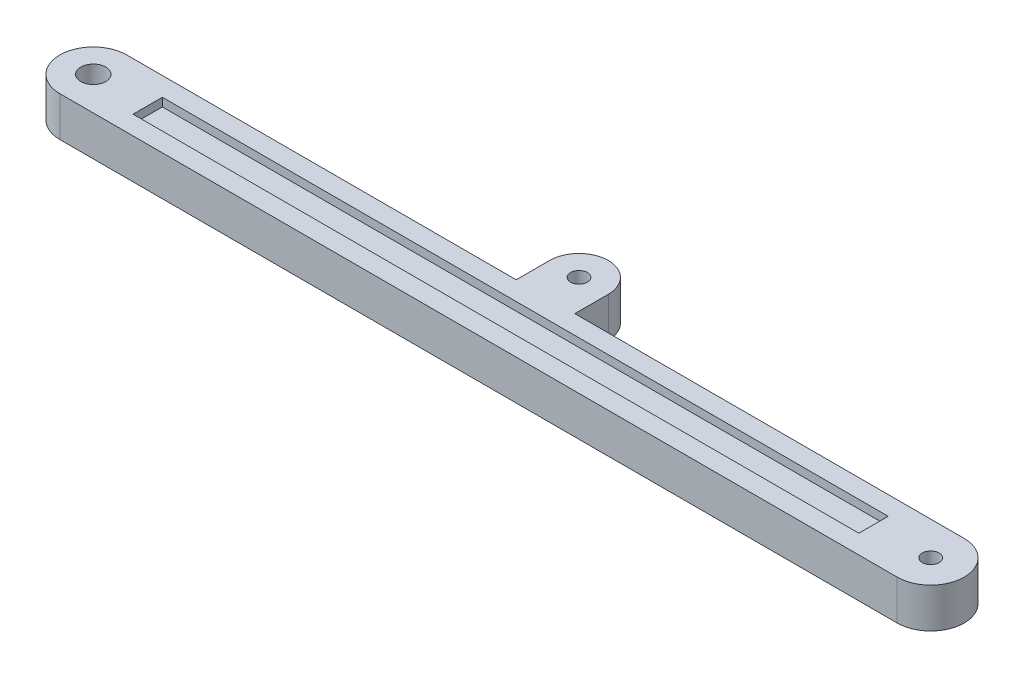
ISO-10303-21;
HEADER;
FILE_DESCRIPTION(('STEP AP214'),'2;1');
FILE_NAME('part.step','',(''),(''),'','','');
FILE_SCHEMA(('AUTOMOTIVE_DESIGN { 1 0 10303 214 1 1 1 1 }'));
ENDSEC;
DATA;
#1=APPLICATION_CONTEXT('core data for automotive mechanical design processes');
#2=APPLICATION_PROTOCOL_DEFINITION('international standard','automotive_design',2000,#1);
#3=PRODUCT_CONTEXT('',#1,'mechanical');
#4=PRODUCT('Part','Part','',(#3));
#5=PRODUCT_RELATED_PRODUCT_CATEGORY('part','',(#4));
#6=PRODUCT_DEFINITION_FORMATION('','',#4);
#7=PRODUCT_DEFINITION_CONTEXT('part definition',#1,'design');
#8=PRODUCT_DEFINITION('design','',#6,#7);
#9=PRODUCT_DEFINITION_SHAPE('','',#8);
#10=(LENGTH_UNIT() NAMED_UNIT(*) SI_UNIT(.MILLI.,.METRE.));
#11=(NAMED_UNIT(*) PLANE_ANGLE_UNIT() SI_UNIT($,.RADIAN.));
#12=(NAMED_UNIT(*) SI_UNIT($,.STERADIAN.) SOLID_ANGLE_UNIT());
#13=UNCERTAINTY_MEASURE_WITH_UNIT(LENGTH_MEASURE(1.E-05),#10,'distance_accuracy_value','');
#14=(GEOMETRIC_REPRESENTATION_CONTEXT(3) GLOBAL_UNCERTAINTY_ASSIGNED_CONTEXT((#13)) GLOBAL_UNIT_ASSIGNED_CONTEXT((#10,
#11,#12)) REPRESENTATION_CONTEXT('',''));
#15=CARTESIAN_POINT('',(0.,0.,0.));
#16=DIRECTION('',(0.,0.,1.));
#17=DIRECTION('',(1.,0.,0.));
#18=AXIS2_PLACEMENT_3D('',#15,#16,#17);
#19=CARTESIAN_POINT('',(-10.,9.5,-8.));
#20=DIRECTION('',(0.,-1.,0.));
#21=DIRECTION('',(0.,0.,-1.));
#22=AXIS2_PLACEMENT_3D('',#19,#20,#21);
#23=CYLINDRICAL_SURFACE('',#22,8.);
#24=CARTESIAN_POINT('',(-10.,0.,-8.));
#25=DIRECTION('',(0.,1.,0.));
#26=DIRECTION('',(0.,0.,1.));
#27=AXIS2_PLACEMENT_3D('',#24,#25,#26);
#28=CIRCLE('',#27,8.);
#29=CARTESIAN_POINT('',(-10.,0.,-16.));
#30=VERTEX_POINT('',#29);
#31=CARTESIAN_POINT('',(-10.,0.,0.));
#32=VERTEX_POINT('',#31);
#33=EDGE_CURVE('E155',#30,#32,#28,.T.);
#34=ORIENTED_EDGE('',*,*,#33,.T.);
#35=DIRECTION('',(0.,-1.,0.));
#36=VECTOR('',#35,1.);
#37=CARTESIAN_POINT('',(-10.,9.5,0.));
#38=LINE('',#37,#36);
#39=CARTESIAN_POINT('',(-10.,9.5,0.));
#40=VERTEX_POINT('',#39);
#41=EDGE_CURVE('E11',#40,#32,#38,.T.);
#42=ORIENTED_EDGE('',*,*,#41,.F.);
#43=CARTESIAN_POINT('',(-10.,9.5,-8.));
#44=DIRECTION('',(0.,1.,0.));
#45=DIRECTION('',(0.,0.,1.));
#46=AXIS2_PLACEMENT_3D('',#43,#44,#45);
#47=CIRCLE('',#46,8.);
#48=CARTESIAN_POINT('',(-10.,9.5,-16.));
#49=VERTEX_POINT('',#48);
#50=EDGE_CURVE('E208',#49,#40,#47,.T.);
#51=ORIENTED_EDGE('',*,*,#50,.F.);
#52=DIRECTION('',(0.,-1.,0.));
#53=VECTOR('',#52,1.);
#54=CARTESIAN_POINT('',(-10.,9.5,-16.));
#55=LINE('',#54,#53);
#56=EDGE_CURVE('E58',#49,#30,#55,.T.);
#57=ORIENTED_EDGE('',*,*,#56,.T.);
#58=EDGE_LOOP('',(#34,#42,#51,#57));
#59=FACE_BOUND('',#58,.T.);
#60=ADVANCED_FACE('F34',(#59),#23,.T.);
#61=CARTESIAN_POINT('',(0.,9.5,0.));
#62=DIRECTION('',(0.,0.,-1.));
#63=DIRECTION('',(-1.,0.,0.));
#64=AXIS2_PLACEMENT_3D('',#61,#62,#63);
#65=PLANE('',#64);
#66=DIRECTION('',(1.,0.,0.));
#67=VECTOR('',#66,1.);
#68=CARTESIAN_POINT('',(0.,0.,0.));
#69=LINE('',#68,#67);
#70=CARTESIAN_POINT('',(190.,0.,0.));
#71=VERTEX_POINT('',#70);
#72=EDGE_CURVE('E158',#32,#71,#69,.T.);
#73=ORIENTED_EDGE('',*,*,#72,.T.);
#74=DIRECTION('',(0.,-1.,0.));
#75=VECTOR('',#74,1.);
#76=CARTESIAN_POINT('',(190.,9.5,0.));
#77=LINE('',#76,#75);
#78=CARTESIAN_POINT('',(190.,9.5,0.));
#79=VERTEX_POINT('',#78);
#80=EDGE_CURVE('E42',#79,#71,#77,.T.);
#81=ORIENTED_EDGE('',*,*,#80,.F.);
#82=DIRECTION('',(1.,0.,0.));
#83=VECTOR('',#82,1.);
#84=CARTESIAN_POINT('',(0.,9.5,0.));
#85=LINE('',#84,#83);
#86=EDGE_CURVE('E97',#40,#79,#85,.T.);
#87=ORIENTED_EDGE('',*,*,#86,.F.);
#88=ORIENTED_EDGE('',*,*,#41,.T.);
#89=EDGE_LOOP('',(#73,#81,#87,#88));
#90=FACE_BOUND('',#89,.T.);
#91=ADVANCED_FACE('F283',(#90),#65,.F.);
#92=CARTESIAN_POINT('',(190.,9.5,-8.00000000000002));
#93=DIRECTION('',(0.,-1.,0.));
#94=DIRECTION('',(0.,0.,-1.));
#95=AXIS2_PLACEMENT_3D('',#92,#93,#94);
#96=CYLINDRICAL_SURFACE('',#95,8.00000000000001);
#97=CARTESIAN_POINT('',(190.,0.,-8.00000000000002));
#98=DIRECTION('',(0.,1.,0.));
#99=DIRECTION('',(0.,0.,1.));
#100=AXIS2_PLACEMENT_3D('',#97,#98,#99);
#101=CIRCLE('',#100,8.00000000000001);
#102=CARTESIAN_POINT('',(190.,0.,-16.));
#103=VERTEX_POINT('',#102);
#104=EDGE_CURVE('E160',#71,#103,#101,.T.);
#105=ORIENTED_EDGE('',*,*,#104,.T.);
#106=DIRECTION('',(0.,-1.,0.));
#107=VECTOR('',#106,1.);
#108=CARTESIAN_POINT('',(190.,9.5,-16.));
#109=LINE('',#108,#107);
#110=CARTESIAN_POINT('',(190.,9.5,-16.));
#111=VERTEX_POINT('',#110);
#112=EDGE_CURVE('E187',#111,#103,#109,.T.);
#113=ORIENTED_EDGE('',*,*,#112,.F.);
#114=CARTESIAN_POINT('',(190.,9.5,-8.00000000000002));
#115=DIRECTION('',(0.,1.,0.));
#116=DIRECTION('',(0.,0.,1.));
#117=AXIS2_PLACEMENT_3D('',#114,#115,#116);
#118=CIRCLE('',#117,8.00000000000001);
#119=EDGE_CURVE('E194',#79,#111,#118,.T.);
#120=ORIENTED_EDGE('',*,*,#119,.F.);
#121=ORIENTED_EDGE('',*,*,#80,.T.);
#122=EDGE_LOOP('',(#105,#113,#120,#121));
#123=FACE_BOUND('',#122,.T.);
#124=ADVANCED_FACE('F192',(#123),#96,.T.);
#125=CARTESIAN_POINT('',(0.,9.5,-16.));
#126=DIRECTION('',(0.,0.,-1.));
#127=DIRECTION('',(-1.,0.,0.));
#128=AXIS2_PLACEMENT_3D('',#125,#126,#127);
#129=PLANE('',#128);
#130=DIRECTION('',(1.,0.,0.));
#131=VECTOR('',#130,1.);
#132=CARTESIAN_POINT('',(0.,0.,-16.));
#133=LINE('',#132,#131);
#134=CARTESIAN_POINT('',(97.,0.,-16.));
#135=VERTEX_POINT('',#134);
#136=EDGE_CURVE('E163',#135,#103,#133,.T.);
#137=ORIENTED_EDGE('',*,*,#136,.F.);
#138=DIRECTION('',(0.,-1.,0.));
#139=VECTOR('',#138,1.);
#140=CARTESIAN_POINT('',(97.,9.5,-16.));
#141=LINE('',#140,#139);
#142=CARTESIAN_POINT('',(97.,9.5,-16.));
#143=VERTEX_POINT('',#142);
#144=EDGE_CURVE('E185',#143,#135,#141,.T.);
#145=ORIENTED_EDGE('',*,*,#144,.F.);
#146=DIRECTION('',(1.,0.,0.));
#147=VECTOR('',#146,1.);
#148=CARTESIAN_POINT('',(0.,9.5,-16.));
#149=LINE('',#148,#147);
#150=EDGE_CURVE('E203',#143,#111,#149,.T.);
#151=ORIENTED_EDGE('',*,*,#150,.T.);
#152=ORIENTED_EDGE('',*,*,#112,.T.);
#153=EDGE_LOOP('',(#137,#145,#151,#152));
#154=FACE_BOUND('',#153,.T.);
#155=ADVANCED_FACE('F201',(#154),#129,.T.);
#156=CARTESIAN_POINT('',(97.,9.5,0.));
#157=DIRECTION('',(1.,0.,0.));
#158=DIRECTION('',(0.,0.,-1.));
#159=AXIS2_PLACEMENT_3D('',#156,#157,#158);
#160=PLANE('',#159);
#161=DIRECTION('',(0.,0.,1.));
#162=VECTOR('',#161,1.);
#163=CARTESIAN_POINT('',(97.,0.,0.));
#164=LINE('',#163,#162);
#165=CARTESIAN_POINT('',(97.,0.,-24.));
#166=VERTEX_POINT('',#165);
#167=EDGE_CURVE('E166',#166,#135,#164,.T.);
#168=ORIENTED_EDGE('',*,*,#167,.F.);
#169=DIRECTION('',(0.,-1.,0.));
#170=VECTOR('',#169,1.);
#171=CARTESIAN_POINT('',(97.,9.5,-24.));
#172=LINE('',#171,#170);
#173=CARTESIAN_POINT('',(97.,9.5,-24.));
#174=VERTEX_POINT('',#173);
#175=EDGE_CURVE('E137',#174,#166,#172,.T.);
#176=ORIENTED_EDGE('',*,*,#175,.F.);
#177=DIRECTION('',(0.,0.,1.));
#178=VECTOR('',#177,1.);
#179=CARTESIAN_POINT('',(97.,9.5,0.));
#180=LINE('',#179,#178);
#181=EDGE_CURVE('E126',#174,#143,#180,.T.);
#182=ORIENTED_EDGE('',*,*,#181,.T.);
#183=ORIENTED_EDGE('',*,*,#144,.T.);
#184=EDGE_LOOP('',(#168,#176,#182,#183));
#185=FACE_BOUND('',#184,.T.);
#186=ADVANCED_FACE('F293',(#185),#160,.T.);
#187=CARTESIAN_POINT('',(90.,9.5,-24.));
#188=DIRECTION('',(0.,-1.,0.));
#189=DIRECTION('',(0.,0.,-1.));
#190=AXIS2_PLACEMENT_3D('',#187,#188,#189);
#191=CYLINDRICAL_SURFACE('',#190,7.00000000000002);
#192=CARTESIAN_POINT('',(90.,0.,-24.));
#193=DIRECTION('',(0.,1.,0.));
#194=DIRECTION('',(0.,0.,1.));
#195=AXIS2_PLACEMENT_3D('',#192,#193,#194);
#196=CIRCLE('',#195,7.00000000000002);
#197=CARTESIAN_POINT('',(83.,0.,-24.));
#198=VERTEX_POINT('',#197);
#199=EDGE_CURVE('E133',#166,#198,#196,.T.);
#200=ORIENTED_EDGE('',*,*,#199,.T.);
#201=DIRECTION('',(0.,-1.,0.));
#202=VECTOR('',#201,1.);
#203=CARTESIAN_POINT('',(83.,9.5,-24.));
#204=LINE('',#203,#202);
#205=CARTESIAN_POINT('',(83.,9.5,-24.));
#206=VERTEX_POINT('',#205);
#207=EDGE_CURVE('E130',#206,#198,#204,.T.);
#208=ORIENTED_EDGE('',*,*,#207,.F.);
#209=CARTESIAN_POINT('',(90.,9.5,-24.));
#210=DIRECTION('',(0.,1.,0.));
#211=DIRECTION('',(0.,0.,1.));
#212=AXIS2_PLACEMENT_3D('',#209,#210,#211);
#213=CIRCLE('',#212,7.00000000000002);
#214=EDGE_CURVE('E116',#174,#206,#213,.T.);
#215=ORIENTED_EDGE('',*,*,#214,.F.);
#216=ORIENTED_EDGE('',*,*,#175,.T.);
#217=EDGE_LOOP('',(#200,#208,#215,#216));
#218=FACE_BOUND('',#217,.T.);
#219=ADVANCED_FACE('F131',(#218),#191,.T.);
#220=CARTESIAN_POINT('',(83.,9.5,0.));
#221=DIRECTION('',(1.,0.,0.));
#222=DIRECTION('',(0.,0.,-1.));
#223=AXIS2_PLACEMENT_3D('',#220,#221,#222);
#224=PLANE('',#223);
#225=DIRECTION('',(0.,0.,1.));
#226=VECTOR('',#225,1.);
#227=CARTESIAN_POINT('',(83.,0.,0.));
#228=LINE('',#227,#226);
#229=CARTESIAN_POINT('',(83.,0.,-16.));
#230=VERTEX_POINT('',#229);
#231=EDGE_CURVE('E170',#198,#230,#228,.T.);
#232=ORIENTED_EDGE('',*,*,#231,.T.);
#233=DIRECTION('',(0.,-1.,0.));
#234=VECTOR('',#233,1.);
#235=CARTESIAN_POINT('',(83.,9.5,-16.));
#236=LINE('',#235,#234);
#237=CARTESIAN_POINT('',(83.,9.5,-16.));
#238=VERTEX_POINT('',#237);
#239=EDGE_CURVE('E138',#238,#230,#236,.T.);
#240=ORIENTED_EDGE('',*,*,#239,.F.);
#241=DIRECTION('',(0.,0.,1.));
#242=VECTOR('',#241,1.);
#243=CARTESIAN_POINT('',(83.,9.5,0.));
#244=LINE('',#243,#242);
#245=EDGE_CURVE('E122',#206,#238,#244,.T.);
#246=ORIENTED_EDGE('',*,*,#245,.F.);
#247=ORIENTED_EDGE('',*,*,#207,.T.);
#248=EDGE_LOOP('',(#232,#240,#246,#247));
#249=FACE_BOUND('',#248,.T.);
#250=ADVANCED_FACE('F140',(#249),#224,.F.);
#251=CARTESIAN_POINT('',(90.,9.5,-24.));
#252=DIRECTION('',(0.,-1.,0.));
#253=DIRECTION('',(0.,0.,-1.));
#254=AXIS2_PLACEMENT_3D('',#251,#252,#253);
#255=CYLINDRICAL_SURFACE('',#254,2.);
#256=CARTESIAN_POINT('',(90.,9.5,-24.));
#257=DIRECTION('',(0.,1.,0.));
#258=DIRECTION('',(0.,0.,1.));
#259=AXIS2_PLACEMENT_3D('',#256,#257,#258);
#260=CIRCLE('',#259,2.);
#261=CARTESIAN_POINT('',(90.,9.5,-22.));
#262=VERTEX_POINT('',#261);
#263=EDGE_CURVE('E143',#262,#262,#260,.T.);
#264=ORIENTED_EDGE('',*,*,#263,.T.);
#265=EDGE_LOOP('',(#264));
#266=FACE_BOUND('',#265,.T.);
#267=CARTESIAN_POINT('',(90.,0.,-24.));
#268=DIRECTION('',(0.,1.,0.));
#269=DIRECTION('',(0.,0.,1.));
#270=AXIS2_PLACEMENT_3D('',#267,#268,#269);
#271=CIRCLE('',#270,2.);
#272=CARTESIAN_POINT('',(90.,0.,-22.));
#273=VERTEX_POINT('',#272);
#274=EDGE_CURVE('E175',#273,#273,#271,.T.);
#275=ORIENTED_EDGE('',*,*,#274,.F.);
#276=EDGE_LOOP('',(#275));
#277=FACE_BOUND('',#276,.T.);
#278=ADVANCED_FACE('F301',(#266,#277),#255,.F.);
#279=CARTESIAN_POINT('',(0.,9.5,-16.));
#280=DIRECTION('',(0.,0.,-1.));
#281=DIRECTION('',(-1.,0.,0.));
#282=AXIS2_PLACEMENT_3D('',#279,#280,#281);
#283=PLANE('',#282);
#284=DIRECTION('',(1.,0.,0.));
#285=VECTOR('',#284,1.);
#286=CARTESIAN_POINT('',(0.,0.,-16.));
#287=LINE('',#286,#285);
#288=EDGE_CURVE('E172',#30,#230,#287,.T.);
#289=ORIENTED_EDGE('',*,*,#288,.F.);
#290=ORIENTED_EDGE('',*,*,#56,.F.);
#291=DIRECTION('',(1.,0.,0.));
#292=VECTOR('',#291,1.);
#293=CARTESIAN_POINT('',(0.,9.5,-16.));
#294=LINE('',#293,#292);
#295=EDGE_CURVE('E141',#49,#238,#294,.T.);
#296=ORIENTED_EDGE('',*,*,#295,.T.);
#297=ORIENTED_EDGE('',*,*,#239,.T.);
#298=EDGE_LOOP('',(#289,#290,#296,#297));
#299=FACE_BOUND('',#298,.T.);
#300=ADVANCED_FACE('F302',(#299),#283,.T.);
#301=CARTESIAN_POINT('',(-10.,9.5,-8.));
#302=DIRECTION('',(0.,-1.,0.));
#303=DIRECTION('',(0.,0.,-1.));
#304=AXIS2_PLACEMENT_3D('',#301,#302,#303);
#305=CYLINDRICAL_SURFACE('',#304,3.);
#306=CARTESIAN_POINT('',(-10.,9.5,-8.));
#307=DIRECTION('',(0.,1.,0.));
#308=DIRECTION('',(0.,0.,1.));
#309=AXIS2_PLACEMENT_3D('',#306,#307,#308);
#310=CIRCLE('',#309,3.);
#311=CARTESIAN_POINT('',(-10.,9.5,-5.));
#312=VERTEX_POINT('',#311);
#313=EDGE_CURVE('E181',#312,#312,#310,.T.);
#314=ORIENTED_EDGE('',*,*,#313,.T.);
#315=EDGE_LOOP('',(#314));
#316=FACE_BOUND('',#315,.T.);
#317=CARTESIAN_POINT('',(-10.,0.,-8.));
#318=DIRECTION('',(0.,1.,0.));
#319=DIRECTION('',(0.,0.,1.));
#320=AXIS2_PLACEMENT_3D('',#317,#318,#319);
#321=CIRCLE('',#320,3.);
#322=CARTESIAN_POINT('',(-10.,0.,-5.));
#323=VERTEX_POINT('',#322);
#324=EDGE_CURVE('E152',#323,#323,#321,.T.);
#325=ORIENTED_EDGE('',*,*,#324,.F.);
#326=EDGE_LOOP('',(#325));
#327=FACE_BOUND('',#326,.T.);
#328=ADVANCED_FACE('F36',(#316,#327),#305,.F.);
#329=CARTESIAN_POINT('',(190.,9.5,-8.00000000000002));
#330=DIRECTION('',(0.,-1.,0.));
#331=DIRECTION('',(0.,0.,-1.));
#332=AXIS2_PLACEMENT_3D('',#329,#330,#331);
#333=CYLINDRICAL_SURFACE('',#332,2.);
#334=CARTESIAN_POINT('',(190.,9.5,-8.00000000000002));
#335=DIRECTION('',(0.,1.,0.));
#336=DIRECTION('',(0.,0.,1.));
#337=AXIS2_PLACEMENT_3D('',#334,#335,#336);
#338=CIRCLE('',#337,2.);
#339=CARTESIAN_POINT('',(190.,9.5,-6.00000000000002));
#340=VERTEX_POINT('',#339);
#341=EDGE_CURVE('E149',#340,#340,#338,.T.);
#342=ORIENTED_EDGE('',*,*,#341,.T.);
#343=EDGE_LOOP('',(#342));
#344=FACE_BOUND('',#343,.T.);
#345=CARTESIAN_POINT('',(190.,0.,-8.00000000000002));
#346=DIRECTION('',(0.,1.,0.));
#347=DIRECTION('',(0.,0.,1.));
#348=AXIS2_PLACEMENT_3D('',#345,#346,#347);
#349=CIRCLE('',#348,2.);
#350=CARTESIAN_POINT('',(190.,0.,-6.00000000000002));
#351=VERTEX_POINT('',#350);
#352=EDGE_CURVE('E178',#351,#351,#349,.T.);
#353=ORIENTED_EDGE('',*,*,#352,.F.);
#354=EDGE_LOOP('',(#353));
#355=FACE_BOUND('',#354,.T.);
#356=ADVANCED_FACE('F308',(#344,#355),#333,.F.);
#357=CARTESIAN_POINT('',(0.,9.5,0.));
#358=DIRECTION('',(0.,1.,0.));
#359=DIRECTION('',(0.,0.,1.));
#360=AXIS2_PLACEMENT_3D('',#357,#358,#359);
#361=PLANE('',#360);
#362=DIRECTION('',(0.,0.,1.));
#363=VECTOR('',#362,1.);
#364=CARTESIAN_POINT('',(3.,9.5,-11.5));
#365=LINE('',#364,#363);
#366=CARTESIAN_POINT('',(3.,9.5,-11.5));
#367=VERTEX_POINT('',#366);
#368=CARTESIAN_POINT('',(3.,9.5,-4.5));
#369=VERTEX_POINT('',#368);
#370=EDGE_CURVE('E49',#367,#369,#365,.T.);
#371=ORIENTED_EDGE('',*,*,#370,.F.);
#372=DIRECTION('',(-1.,0.,0.));
#373=VECTOR('',#372,1.);
#374=CARTESIAN_POINT('',(3.,9.5,-11.5));
#375=LINE('',#374,#373);
#376=CARTESIAN_POINT('',(176.341634435007,9.5,-11.5));
#377=VERTEX_POINT('',#376);
#378=EDGE_CURVE('E222',#377,#367,#375,.T.);
#379=ORIENTED_EDGE('',*,*,#378,.F.);
#380=DIRECTION('',(0.,0.,-1.));
#381=VECTOR('',#380,1.);
#382=CARTESIAN_POINT('',(176.341634435007,9.5,-11.5));
#383=LINE('',#382,#381);
#384=CARTESIAN_POINT('',(176.341634435007,9.5,-4.5));
#385=VERTEX_POINT('',#384);
#386=EDGE_CURVE('E226',#385,#377,#383,.T.);
#387=ORIENTED_EDGE('',*,*,#386,.F.);
#388=DIRECTION('',(1.,0.,0.));
#389=VECTOR('',#388,1.);
#390=CARTESIAN_POINT('',(3.,9.5,-4.5));
#391=LINE('',#390,#389);
#392=EDGE_CURVE('E229',#369,#385,#391,.T.);
#393=ORIENTED_EDGE('',*,*,#392,.F.);
#394=EDGE_LOOP('',(#371,#379,#387,#393));
#395=FACE_BOUND('',#394,.T.);
#396=ORIENTED_EDGE('',*,*,#313,.F.);
#397=EDGE_LOOP('',(#396));
#398=FACE_BOUND('',#397,.T.);
#399=ORIENTED_EDGE('',*,*,#50,.T.);
#400=ORIENTED_EDGE('',*,*,#86,.T.);
#401=ORIENTED_EDGE('',*,*,#119,.T.);
#402=ORIENTED_EDGE('',*,*,#150,.F.);
#403=ORIENTED_EDGE('',*,*,#181,.F.);
#404=ORIENTED_EDGE('',*,*,#214,.T.);
#405=ORIENTED_EDGE('',*,*,#245,.T.);
#406=ORIENTED_EDGE('',*,*,#295,.F.);
#407=EDGE_LOOP('',(#399,#400,#401,#402,#403,#404,#405,#406));
#408=FACE_BOUND('',#407,.T.);
#409=ORIENTED_EDGE('',*,*,#263,.F.);
#410=EDGE_LOOP('',(#409));
#411=FACE_BOUND('',#410,.T.);
#412=ORIENTED_EDGE('',*,*,#341,.F.);
#413=EDGE_LOOP('',(#412));
#414=FACE_BOUND('',#413,.T.);
#415=ADVANCED_FACE('F118',(#395,#398,#408,#411,#414),#361,.T.);
#416=CARTESIAN_POINT('',(0.,0.,0.));
#417=DIRECTION('',(0.,1.,0.));
#418=DIRECTION('',(0.,0.,1.));
#419=AXIS2_PLACEMENT_3D('',#416,#417,#418);
#420=PLANE('',#419);
#421=ORIENTED_EDGE('',*,*,#324,.T.);
#422=EDGE_LOOP('',(#421));
#423=FACE_BOUND('',#422,.T.);
#424=ORIENTED_EDGE('',*,*,#33,.F.);
#425=ORIENTED_EDGE('',*,*,#288,.T.);
#426=ORIENTED_EDGE('',*,*,#231,.F.);
#427=ORIENTED_EDGE('',*,*,#199,.F.);
#428=ORIENTED_EDGE('',*,*,#167,.T.);
#429=ORIENTED_EDGE('',*,*,#136,.T.);
#430=ORIENTED_EDGE('',*,*,#104,.F.);
#431=ORIENTED_EDGE('',*,*,#72,.F.);
#432=EDGE_LOOP('',(#424,#425,#426,#427,#428,#429,#430,#431));
#433=FACE_BOUND('',#432,.T.);
#434=ORIENTED_EDGE('',*,*,#274,.T.);
#435=EDGE_LOOP('',(#434));
#436=FACE_BOUND('',#435,.T.);
#437=ORIENTED_EDGE('',*,*,#352,.T.);
#438=EDGE_LOOP('',(#437));
#439=FACE_BOUND('',#438,.T.);
#440=ADVANCED_FACE('F196',(#423,#433,#436,#439),#420,.F.);
#441=CARTESIAN_POINT('',(3.,7.5,-11.5));
#442=DIRECTION('',(-1.,0.,0.));
#443=DIRECTION('',(0.,0.,1.));
#444=AXIS2_PLACEMENT_3D('',#441,#442,#443);
#445=PLANE('',#444);
#446=ORIENTED_EDGE('',*,*,#370,.T.);
#447=DIRECTION('',(0.,1.,0.));
#448=VECTOR('',#447,1.);
#449=CARTESIAN_POINT('',(3.,7.5,-4.5));
#450=LINE('',#449,#448);
#451=CARTESIAN_POINT('',(3.,7.5,-4.5));
#452=VERTEX_POINT('',#451);
#453=EDGE_CURVE('E212',#452,#369,#450,.T.);
#454=ORIENTED_EDGE('',*,*,#453,.F.);
#455=DIRECTION('',(0.,0.,1.));
#456=VECTOR('',#455,1.);
#457=CARTESIAN_POINT('',(3.,7.5,-11.5));
#458=LINE('',#457,#456);
#459=CARTESIAN_POINT('',(3.,7.5,-11.5));
#460=VERTEX_POINT('',#459);
#461=EDGE_CURVE('E225',#460,#452,#458,.T.);
#462=ORIENTED_EDGE('',*,*,#461,.F.);
#463=DIRECTION('',(0.,1.,0.));
#464=VECTOR('',#463,1.);
#465=CARTESIAN_POINT('',(3.,7.5,-11.5));
#466=LINE('',#465,#464);
#467=EDGE_CURVE('E156',#460,#367,#466,.T.);
#468=ORIENTED_EDGE('',*,*,#467,.T.);
#469=EDGE_LOOP('',(#446,#454,#462,#468));
#470=FACE_BOUND('',#469,.T.);
#471=ADVANCED_FACE('F250',(#470),#445,.F.);
#472=CARTESIAN_POINT('',(3.,7.5,-11.5));
#473=DIRECTION('',(0.,0.,-1.));
#474=DIRECTION('',(-1.,0.,0.));
#475=AXIS2_PLACEMENT_3D('',#472,#473,#474);
#476=PLANE('',#475);
#477=ORIENTED_EDGE('',*,*,#378,.T.);
#478=ORIENTED_EDGE('',*,*,#467,.F.);
#479=DIRECTION('',(-1.,0.,0.));
#480=VECTOR('',#479,1.);
#481=CARTESIAN_POINT('',(3.,7.5,-11.5));
#482=LINE('',#481,#480);
#483=CARTESIAN_POINT('',(176.341634435007,7.5,-11.5));
#484=VERTEX_POINT('',#483);
#485=EDGE_CURVE('E215',#484,#460,#482,.T.);
#486=ORIENTED_EDGE('',*,*,#485,.F.);
#487=DIRECTION('',(0.,1.,0.));
#488=VECTOR('',#487,1.);
#489=CARTESIAN_POINT('',(176.341634435007,7.5,-11.5));
#490=LINE('',#489,#488);
#491=EDGE_CURVE('E218',#484,#377,#490,.T.);
#492=ORIENTED_EDGE('',*,*,#491,.T.);
#493=EDGE_LOOP('',(#477,#478,#486,#492));
#494=FACE_BOUND('',#493,.T.);
#495=ADVANCED_FACE('F261',(#494),#476,.F.);
#496=CARTESIAN_POINT('',(176.341634435007,7.5,-11.5));
#497=DIRECTION('',(1.,0.,0.));
#498=DIRECTION('',(0.,0.,-1.));
#499=AXIS2_PLACEMENT_3D('',#496,#497,#498);
#500=PLANE('',#499);
#501=ORIENTED_EDGE('',*,*,#386,.T.);
#502=ORIENTED_EDGE('',*,*,#491,.F.);
#503=DIRECTION('',(0.,0.,-1.));
#504=VECTOR('',#503,1.);
#505=CARTESIAN_POINT('',(176.341634435007,7.5,-11.5));
#506=LINE('',#505,#504);
#507=CARTESIAN_POINT('',(176.341634435007,7.5,-4.5));
#508=VERTEX_POINT('',#507);
#509=EDGE_CURVE('E235',#508,#484,#506,.T.);
#510=ORIENTED_EDGE('',*,*,#509,.F.);
#511=DIRECTION('',(0.,1.,0.));
#512=VECTOR('',#511,1.);
#513=CARTESIAN_POINT('',(176.341634435007,7.5,-4.5));
#514=LINE('',#513,#512);
#515=EDGE_CURVE('E214',#508,#385,#514,.T.);
#516=ORIENTED_EDGE('',*,*,#515,.T.);
#517=EDGE_LOOP('',(#501,#502,#510,#516));
#518=FACE_BOUND('',#517,.T.);
#519=ADVANCED_FACE('F266',(#518),#500,.F.);
#520=CARTESIAN_POINT('',(3.,7.5,-4.5));
#521=DIRECTION('',(0.,0.,1.));
#522=DIRECTION('',(1.,0.,0.));
#523=AXIS2_PLACEMENT_3D('',#520,#521,#522);
#524=PLANE('',#523);
#525=ORIENTED_EDGE('',*,*,#392,.T.);
#526=ORIENTED_EDGE('',*,*,#515,.F.);
#527=DIRECTION('',(1.,0.,0.));
#528=VECTOR('',#527,1.);
#529=CARTESIAN_POINT('',(3.,7.5,-4.5));
#530=LINE('',#529,#528);
#531=EDGE_CURVE('E238',#452,#508,#530,.T.);
#532=ORIENTED_EDGE('',*,*,#531,.F.);
#533=ORIENTED_EDGE('',*,*,#453,.T.);
#534=EDGE_LOOP('',(#525,#526,#532,#533));
#535=FACE_BOUND('',#534,.T.);
#536=ADVANCED_FACE('F272',(#535),#524,.F.);
#537=CARTESIAN_POINT('',(0.,7.5,0.));
#538=DIRECTION('',(0.,1.,0.));
#539=DIRECTION('',(0.,0.,1.));
#540=AXIS2_PLACEMENT_3D('',#537,#538,#539);
#541=PLANE('',#540);
#542=ORIENTED_EDGE('',*,*,#461,.T.);
#543=ORIENTED_EDGE('',*,*,#531,.T.);
#544=ORIENTED_EDGE('',*,*,#509,.T.);
#545=ORIENTED_EDGE('',*,*,#485,.T.);
#546=EDGE_LOOP('',(#542,#543,#544,#545));
#547=FACE_BOUND('',#546,.T.);
#548=ADVANCED_FACE('F245',(#547),#541,.T.);
#549=CLOSED_SHELL('',(#60,#91,#124,#155,#186,#219,#250,#278,#300,#328,#356,#415,#440,#471,#495,
#519,#536,#548));
#550=MANIFOLD_SOLID_BREP('B2',#549);
#551=ADVANCED_BREP_SHAPE_REPRESENTATION('',(#18,#550),#14);
#552=SHAPE_DEFINITION_REPRESENTATION(#9,#551);
ENDSEC;
END-ISO-10303-21;
